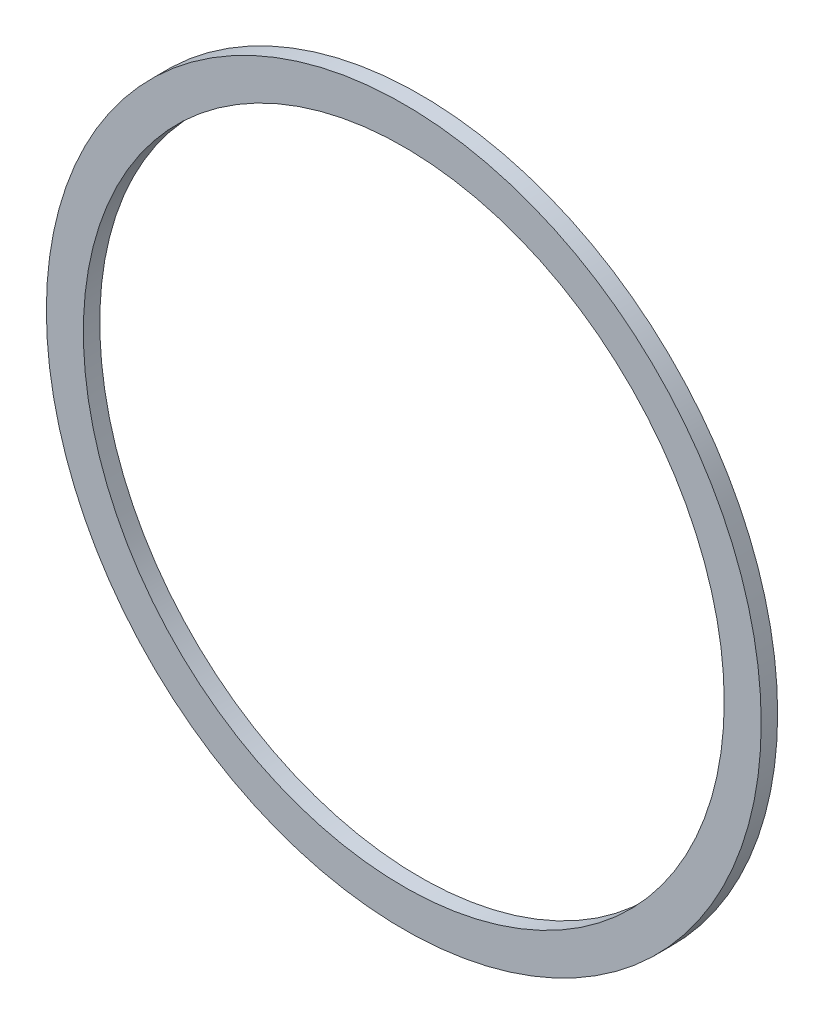
ISO-10303-21;
HEADER;
FILE_DESCRIPTION(('STEP AP214'),'2;1');
FILE_NAME('part.step','',(''),(''),'','','');
FILE_SCHEMA(('AUTOMOTIVE_DESIGN { 1 0 10303 214 1 1 1 1 }'));
ENDSEC;
DATA;
#1=APPLICATION_CONTEXT('core data for automotive mechanical design processes');
#2=APPLICATION_PROTOCOL_DEFINITION('international standard','automotive_design',2000,#1);
#3=PRODUCT_CONTEXT('',#1,'mechanical');
#4=PRODUCT('Part','Part','',(#3));
#5=PRODUCT_RELATED_PRODUCT_CATEGORY('part','',(#4));
#6=PRODUCT_DEFINITION_FORMATION('','',#4);
#7=PRODUCT_DEFINITION_CONTEXT('part definition',#1,'design');
#8=PRODUCT_DEFINITION('design','',#6,#7);
#9=PRODUCT_DEFINITION_SHAPE('','',#8);
#10=(LENGTH_UNIT() NAMED_UNIT(*) SI_UNIT(.MILLI.,.METRE.));
#11=(NAMED_UNIT(*) PLANE_ANGLE_UNIT() SI_UNIT($,.RADIAN.));
#12=(NAMED_UNIT(*) SI_UNIT($,.STERADIAN.) SOLID_ANGLE_UNIT());
#13=UNCERTAINTY_MEASURE_WITH_UNIT(LENGTH_MEASURE(1.E-05),#10,'distance_accuracy_value','');
#14=(GEOMETRIC_REPRESENTATION_CONTEXT(3) GLOBAL_UNCERTAINTY_ASSIGNED_CONTEXT((#13)) GLOBAL_UNIT_ASSIGNED_CONTEXT((#10,
#11,#12)) REPRESENTATION_CONTEXT('',''));
#15=CARTESIAN_POINT('',(0.,0.,0.));
#16=DIRECTION('',(0.,0.,1.));
#17=DIRECTION('',(1.,0.,0.));
#18=AXIS2_PLACEMENT_3D('',#15,#16,#17);
#19=CARTESIAN_POINT('',(0.,0.,2.));
#20=DIRECTION('',(0.,0.,1.));
#21=DIRECTION('',(1.,0.,0.));
#22=AXIS2_PLACEMENT_3D('',#19,#20,#21);
#23=PLANE('',#22);
#24=CARTESIAN_POINT('',(0.,0.,2.));
#25=DIRECTION('',(0.,0.,1.));
#26=DIRECTION('',(1.,0.,0.));
#27=AXIS2_PLACEMENT_3D('',#24,#25,#26);
#28=CIRCLE('',#27,43.5);
#29=CARTESIAN_POINT('',(43.5,0.,2.));
#30=VERTEX_POINT('',#29);
#31=EDGE_CURVE('E10',#30,#30,#28,.T.);
#32=ORIENTED_EDGE('',*,*,#31,.T.);
#33=EDGE_LOOP('',(#32));
#34=FACE_BOUND('',#33,.T.);
#35=CARTESIAN_POINT('',(0.,0.,2.));
#36=DIRECTION('',(0.,0.,1.));
#37=DIRECTION('',(1.,0.,0.));
#38=AXIS2_PLACEMENT_3D('',#35,#36,#37);
#39=CIRCLE('',#38,39.);
#40=CARTESIAN_POINT('',(39.,0.,2.));
#41=VERTEX_POINT('',#40);
#42=EDGE_CURVE('E50',#41,#41,#39,.T.);
#43=ORIENTED_EDGE('',*,*,#42,.F.);
#44=EDGE_LOOP('',(#43));
#45=FACE_BOUND('',#44,.T.);
#46=ADVANCED_FACE('F37',(#34,#45),#23,.T.);
#47=CARTESIAN_POINT('',(0.,0.,0.));
#48=DIRECTION('',(0.,0.,1.));
#49=DIRECTION('',(1.,0.,0.));
#50=AXIS2_PLACEMENT_3D('',#47,#48,#49);
#51=PLANE('',#50);
#52=CARTESIAN_POINT('',(0.,0.,0.));
#53=DIRECTION('',(0.,0.,1.));
#54=DIRECTION('',(1.,0.,0.));
#55=AXIS2_PLACEMENT_3D('',#52,#53,#54);
#56=CIRCLE('',#55,43.5);
#57=CARTESIAN_POINT('',(43.5,0.,0.));
#58=VERTEX_POINT('',#57);
#59=EDGE_CURVE('E41',#58,#58,#56,.T.);
#60=ORIENTED_EDGE('',*,*,#59,.F.);
#61=EDGE_LOOP('',(#60));
#62=FACE_BOUND('',#61,.T.);
#63=CARTESIAN_POINT('',(0.,0.,0.));
#64=DIRECTION('',(0.,0.,1.));
#65=DIRECTION('',(1.,0.,0.));
#66=AXIS2_PLACEMENT_3D('',#63,#64,#65);
#67=CIRCLE('',#66,39.);
#68=CARTESIAN_POINT('',(39.,0.,0.));
#69=VERTEX_POINT('',#68);
#70=EDGE_CURVE('E52',#69,#69,#67,.T.);
#71=ORIENTED_EDGE('',*,*,#70,.T.);
#72=EDGE_LOOP('',(#71));
#73=FACE_BOUND('',#72,.T.);
#74=ADVANCED_FACE('F64',(#62,#73),#51,.F.);
#75=CARTESIAN_POINT('',(0.,0.,2.));
#76=DIRECTION('',(0.,0.,-1.));
#77=DIRECTION('',(-1.,0.,0.));
#78=AXIS2_PLACEMENT_3D('',#75,#76,#77);
#79=CYLINDRICAL_SURFACE('',#78,43.5);
#80=ORIENTED_EDGE('',*,*,#31,.F.);
#81=EDGE_LOOP('',(#80));
#82=FACE_BOUND('',#81,.T.);
#83=ORIENTED_EDGE('',*,*,#59,.T.);
#84=EDGE_LOOP('',(#83));
#85=FACE_BOUND('',#84,.T.);
#86=ADVANCED_FACE('F39',(#82,#85),#79,.T.);
#87=CARTESIAN_POINT('',(0.,0.,2.));
#88=DIRECTION('',(0.,0.,-1.));
#89=DIRECTION('',(-1.,0.,0.));
#90=AXIS2_PLACEMENT_3D('',#87,#88,#89);
#91=CYLINDRICAL_SURFACE('',#90,39.);
#92=ORIENTED_EDGE('',*,*,#42,.T.);
#93=EDGE_LOOP('',(#92));
#94=FACE_BOUND('',#93,.T.);
#95=ORIENTED_EDGE('',*,*,#70,.F.);
#96=EDGE_LOOP('',(#95));
#97=FACE_BOUND('',#96,.T.);
#98=ADVANCED_FACE('F60',(#94,#97),#91,.F.);
#99=CLOSED_SHELL('',(#46,#74,#86,#98));
#100=MANIFOLD_SOLID_BREP('B2',#99);
#101=ADVANCED_BREP_SHAPE_REPRESENTATION('',(#18,#100),#14);
#102=SHAPE_DEFINITION_REPRESENTATION(#9,#101);
ENDSEC;
END-ISO-10303-21;
